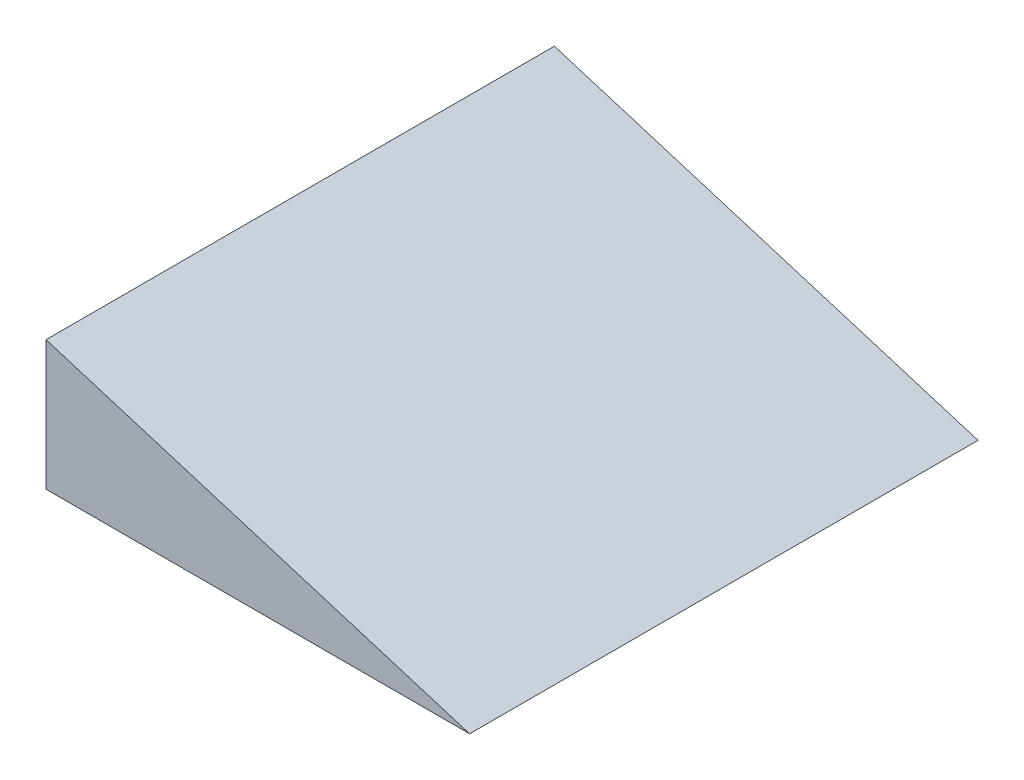
ISO-10303-21;
HEADER;
FILE_DESCRIPTION(('STEP AP214'),'2;1');
FILE_NAME('part.step','',(''),(''),'','','');
FILE_SCHEMA(('AUTOMOTIVE_DESIGN { 1 0 10303 214 1 1 1 1 }'));
ENDSEC;
DATA;
#1=APPLICATION_CONTEXT('core data for automotive mechanical design processes');
#2=APPLICATION_PROTOCOL_DEFINITION('international standard','automotive_design',2000,#1);
#3=PRODUCT_CONTEXT('',#1,'mechanical');
#4=PRODUCT('Part','Part','',(#3));
#5=PRODUCT_RELATED_PRODUCT_CATEGORY('part','',(#4));
#6=PRODUCT_DEFINITION_FORMATION('','',#4);
#7=PRODUCT_DEFINITION_CONTEXT('part definition',#1,'design');
#8=PRODUCT_DEFINITION('design','',#6,#7);
#9=PRODUCT_DEFINITION_SHAPE('','',#8);
#10=(LENGTH_UNIT() NAMED_UNIT(*) SI_UNIT(.MILLI.,.METRE.));
#11=(NAMED_UNIT(*) PLANE_ANGLE_UNIT() SI_UNIT($,.RADIAN.));
#12=(NAMED_UNIT(*) SI_UNIT($,.STERADIAN.) SOLID_ANGLE_UNIT());
#13=UNCERTAINTY_MEASURE_WITH_UNIT(LENGTH_MEASURE(1.E-05),#10,'distance_accuracy_value','');
#14=(GEOMETRIC_REPRESENTATION_CONTEXT(3) GLOBAL_UNCERTAINTY_ASSIGNED_CONTEXT((#13)) GLOBAL_UNIT_ASSIGNED_CONTEXT((#10,
#11,#12)) REPRESENTATION_CONTEXT('',''));
#15=CARTESIAN_POINT('',(0.,0.,0.));
#16=DIRECTION('',(0.,0.,1.));
#17=DIRECTION('',(1.,0.,0.));
#18=AXIS2_PLACEMENT_3D('',#15,#16,#17);
#19=CARTESIAN_POINT('',(-500.,152.865340729327,-600.));
#20=DIRECTION('',(0.29237170472273,0.956304755963037,0.));
#21=DIRECTION('',(-0.956304755963037,0.29237170472273,0.));
#22=AXIS2_PLACEMENT_3D('',#19,#20,#21);
#23=PLANE('',#22);
#24=DIRECTION('',(-0.956304755963037,0.29237170472273,0.));
#25=VECTOR('',#24,1.);
#26=CARTESIAN_POINT('',(-500.,152.865340729327,0.));
#27=LINE('',#26,#25);
#28=CARTESIAN_POINT('',(0.,0.,0.));
#29=VERTEX_POINT('',#28);
#30=CARTESIAN_POINT('',(-500.,152.865340729327,0.));
#31=VERTEX_POINT('',#30);
#32=EDGE_CURVE('E87',#29,#31,#27,.T.);
#33=ORIENTED_EDGE('',*,*,#32,.F.);
#34=DIRECTION('',(0.,0.,1.));
#35=VECTOR('',#34,1.);
#36=CARTESIAN_POINT('',(0.,0.,-600.));
#37=LINE('',#36,#35);
#38=CARTESIAN_POINT('',(0.,0.,-600.));
#39=VERTEX_POINT('',#38);
#40=EDGE_CURVE('E11',#39,#29,#37,.T.);
#41=ORIENTED_EDGE('',*,*,#40,.F.);
#42=DIRECTION('',(-0.956304755963037,0.29237170472273,0.));
#43=VECTOR('',#42,1.);
#44=CARTESIAN_POINT('',(-500.,152.865340729327,-600.));
#45=LINE('',#44,#43);
#46=CARTESIAN_POINT('',(-500.,152.865340729327,-600.));
#47=VERTEX_POINT('',#46);
#48=EDGE_CURVE('E79',#39,#47,#45,.T.);
#49=ORIENTED_EDGE('',*,*,#48,.T.);
#50=DIRECTION('',(0.,0.,1.));
#51=VECTOR('',#50,1.);
#52=CARTESIAN_POINT('',(-500.,152.865340729327,-600.));
#53=LINE('',#52,#51);
#54=EDGE_CURVE('E38',#47,#31,#53,.T.);
#55=ORIENTED_EDGE('',*,*,#54,.T.);
#56=EDGE_LOOP('',(#33,#41,#49,#55));
#57=FACE_BOUND('',#56,.T.);
#58=ADVANCED_FACE('F35',(#57),#23,.T.);
#59=CARTESIAN_POINT('',(0.,0.,-600.));
#60=DIRECTION('',(0.,-1.,0.));
#61=DIRECTION('',(1.,0.,0.));
#62=AXIS2_PLACEMENT_3D('',#59,#60,#61);
#63=PLANE('',#62);
#64=DIRECTION('',(1.,0.,0.));
#65=VECTOR('',#64,1.);
#66=CARTESIAN_POINT('',(0.,0.,0.));
#67=LINE('',#66,#65);
#68=CARTESIAN_POINT('',(-500.,0.,0.));
#69=VERTEX_POINT('',#68);
#70=EDGE_CURVE('E81',#69,#29,#67,.T.);
#71=ORIENTED_EDGE('',*,*,#70,.F.);
#72=DIRECTION('',(0.,0.,1.));
#73=VECTOR('',#72,1.);
#74=CARTESIAN_POINT('',(-500.,0.,-600.));
#75=LINE('',#74,#73);
#76=CARTESIAN_POINT('',(-500.,0.,-600.));
#77=VERTEX_POINT('',#76);
#78=EDGE_CURVE('E44',#77,#69,#75,.T.);
#79=ORIENTED_EDGE('',*,*,#78,.F.);
#80=DIRECTION('',(1.,0.,0.));
#81=VECTOR('',#80,1.);
#82=CARTESIAN_POINT('',(0.,0.,-600.));
#83=LINE('',#82,#81);
#84=EDGE_CURVE('E76',#77,#39,#83,.T.);
#85=ORIENTED_EDGE('',*,*,#84,.T.);
#86=ORIENTED_EDGE('',*,*,#40,.T.);
#87=EDGE_LOOP('',(#71,#79,#85,#86));
#88=FACE_BOUND('',#87,.T.);
#89=ADVANCED_FACE('F91',(#88),#63,.T.);
#90=CARTESIAN_POINT('',(-500.,0.,-600.));
#91=DIRECTION('',(-1.,0.,0.));
#92=DIRECTION('',(0.,0.,1.));
#93=AXIS2_PLACEMENT_3D('',#90,#91,#92);
#94=PLANE('',#93);
#95=DIRECTION('',(0.,-1.,0.));
#96=VECTOR('',#95,1.);
#97=CARTESIAN_POINT('',(-500.,0.,0.));
#98=LINE('',#97,#96);
#99=EDGE_CURVE('E74',#31,#69,#98,.T.);
#100=ORIENTED_EDGE('',*,*,#99,.F.);
#101=ORIENTED_EDGE('',*,*,#54,.F.);
#102=DIRECTION('',(0.,-1.,0.));
#103=VECTOR('',#102,1.);
#104=CARTESIAN_POINT('',(-500.,0.,-600.));
#105=LINE('',#104,#103);
#106=EDGE_CURVE('E72',#47,#77,#105,.T.);
#107=ORIENTED_EDGE('',*,*,#106,.T.);
#108=ORIENTED_EDGE('',*,*,#78,.T.);
#109=EDGE_LOOP('',(#100,#101,#107,#108));
#110=FACE_BOUND('',#109,.T.);
#111=ADVANCED_FACE('F71',(#110),#94,.T.);
#112=CARTESIAN_POINT('',(0.,0.,-600.));
#113=DIRECTION('',(0.,0.,1.));
#114=DIRECTION('',(1.,0.,0.));
#115=AXIS2_PLACEMENT_3D('',#112,#113,#114);
#116=PLANE('',#115);
#117=ORIENTED_EDGE('',*,*,#48,.F.);
#118=ORIENTED_EDGE('',*,*,#84,.F.);
#119=ORIENTED_EDGE('',*,*,#106,.F.);
#120=EDGE_LOOP('',(#117,#118,#119));
#121=FACE_BOUND('',#120,.T.);
#122=ADVANCED_FACE('F78',(#121),#116,.F.);
#123=CARTESIAN_POINT('',(0.,0.,0.));
#124=DIRECTION('',(0.,0.,1.));
#125=DIRECTION('',(1.,0.,0.));
#126=AXIS2_PLACEMENT_3D('',#123,#124,#125);
#127=PLANE('',#126);
#128=ORIENTED_EDGE('',*,*,#32,.T.);
#129=ORIENTED_EDGE('',*,*,#99,.T.);
#130=ORIENTED_EDGE('',*,*,#70,.T.);
#131=EDGE_LOOP('',(#128,#129,#130));
#132=FACE_BOUND('',#131,.T.);
#133=ADVANCED_FACE('F90',(#132),#127,.T.);
#134=CLOSED_SHELL('',(#58,#89,#111,#122,#133));
#135=MANIFOLD_SOLID_BREP('B2',#134);
#136=ADVANCED_BREP_SHAPE_REPRESENTATION('',(#18,#135),#14);
#137=SHAPE_DEFINITION_REPRESENTATION(#9,#136);
ENDSEC;
END-ISO-10303-21;
